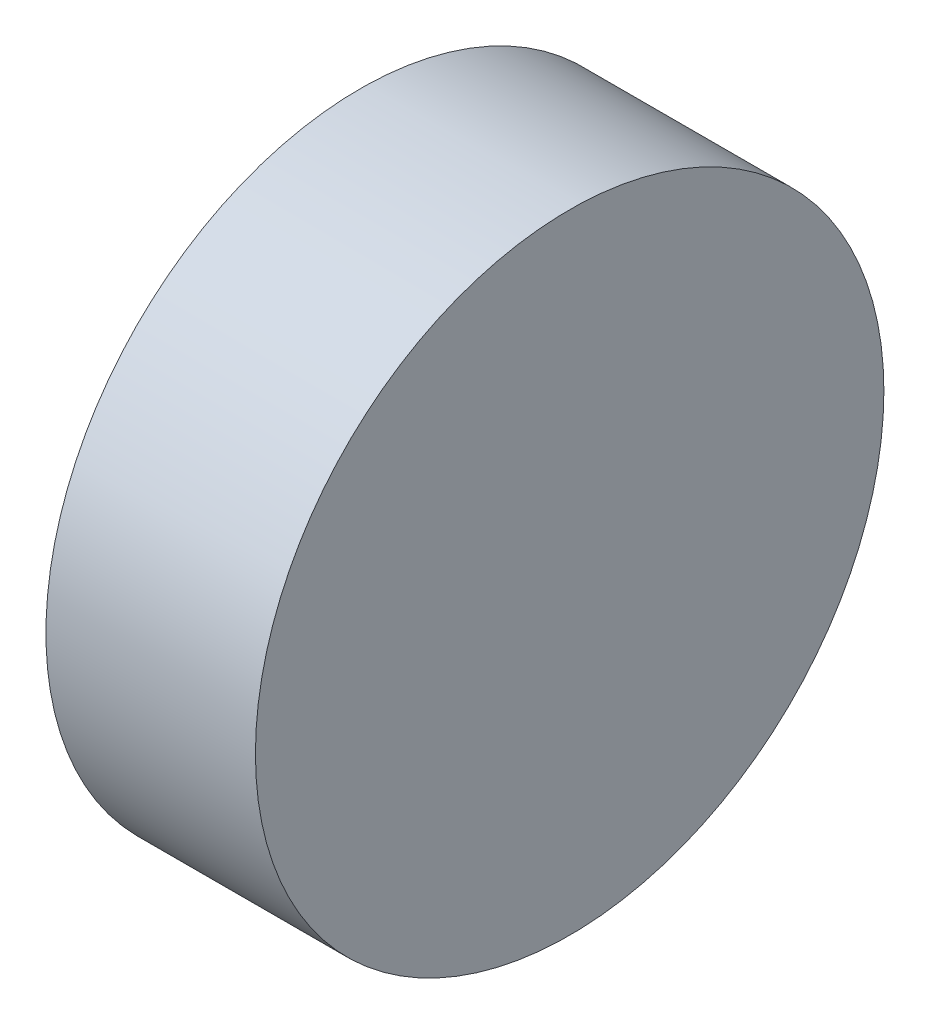
ISO-10303-21;
HEADER;
FILE_DESCRIPTION(('STEP AP214'),'2;1');
FILE_NAME('part.step','',(''),(''),'','','');
FILE_SCHEMA(('AUTOMOTIVE_DESIGN { 1 0 10303 214 1 1 1 1 }'));
ENDSEC;
DATA;
#1=APPLICATION_CONTEXT('core data for automotive mechanical design processes');
#2=APPLICATION_PROTOCOL_DEFINITION('international standard','automotive_design',2000,#1);
#3=PRODUCT_CONTEXT('',#1,'mechanical');
#4=PRODUCT('Part','Part','',(#3));
#5=PRODUCT_RELATED_PRODUCT_CATEGORY('part','',(#4));
#6=PRODUCT_DEFINITION_FORMATION('','',#4);
#7=PRODUCT_DEFINITION_CONTEXT('part definition',#1,'design');
#8=PRODUCT_DEFINITION('design','',#6,#7);
#9=PRODUCT_DEFINITION_SHAPE('','',#8);
#10=(LENGTH_UNIT() NAMED_UNIT(*) SI_UNIT(.MILLI.,.METRE.));
#11=(NAMED_UNIT(*) PLANE_ANGLE_UNIT() SI_UNIT($,.RADIAN.));
#12=(NAMED_UNIT(*) SI_UNIT($,.STERADIAN.) SOLID_ANGLE_UNIT());
#13=UNCERTAINTY_MEASURE_WITH_UNIT(LENGTH_MEASURE(1.E-05),#10,'distance_accuracy_value','');
#14=(GEOMETRIC_REPRESENTATION_CONTEXT(3) GLOBAL_UNCERTAINTY_ASSIGNED_CONTEXT((#13)) GLOBAL_UNIT_ASSIGNED_CONTEXT((#10,
#11,#12)) REPRESENTATION_CONTEXT('',''));
#15=CARTESIAN_POINT('',(0.,0.,0.));
#16=DIRECTION('',(0.,0.,1.));
#17=DIRECTION('',(1.,0.,0.));
#18=AXIS2_PLACEMENT_3D('',#15,#16,#17);
#19=CARTESIAN_POINT('',(2.,0.,0.));
#20=DIRECTION('',(1.,0.,0.));
#21=DIRECTION('',(0.,0.,-1.));
#22=AXIS2_PLACEMENT_3D('',#19,#20,#21);
#23=PLANE('',#22);
#24=CARTESIAN_POINT('',(2.,0.,0.));
#25=DIRECTION('',(-1.,0.,0.));
#26=DIRECTION('',(0.,0.,1.));
#27=AXIS2_PLACEMENT_3D('',#24,#25,#26);
#28=CIRCLE('',#27,6.);
#29=CARTESIAN_POINT('',(2.,0.,6.));
#30=VERTEX_POINT('',#29);
#31=EDGE_CURVE('E10',#30,#30,#28,.T.);
#32=ORIENTED_EDGE('',*,*,#31,.F.);
#33=EDGE_LOOP('',(#32));
#34=FACE_BOUND('',#33,.T.);
#35=ADVANCED_FACE('F15',(#34),#23,.T.);
#36=CARTESIAN_POINT('',(-2.,0.,0.));
#37=DIRECTION('',(-1.,0.,0.));
#38=DIRECTION('',(0.,0.,1.));
#39=AXIS2_PLACEMENT_3D('',#36,#37,#38);
#40=PLANE('',#39);
#41=CARTESIAN_POINT('',(-2.,0.,0.));
#42=DIRECTION('',(1.,0.,0.));
#43=DIRECTION('',(0.,0.,-1.));
#44=AXIS2_PLACEMENT_3D('',#41,#42,#43);
#45=CIRCLE('',#44,6.);
#46=CARTESIAN_POINT('',(-2.,0.,-6.));
#47=VERTEX_POINT('',#46);
#48=EDGE_CURVE('E23',#47,#47,#45,.T.);
#49=ORIENTED_EDGE('',*,*,#48,.F.);
#50=EDGE_LOOP('',(#49));
#51=FACE_BOUND('',#50,.T.);
#52=ADVANCED_FACE('F32',(#51),#40,.T.);
#53=CARTESIAN_POINT('',(-2.,0.,0.));
#54=DIRECTION('',(1.,0.,0.));
#55=DIRECTION('',(0.,0.,-1.));
#56=AXIS2_PLACEMENT_3D('',#53,#54,#55);
#57=CYLINDRICAL_SURFACE('',#56,6.);
#58=ORIENTED_EDGE('',*,*,#31,.T.);
#59=EDGE_LOOP('',(#58));
#60=FACE_BOUND('',#59,.T.);
#61=ORIENTED_EDGE('',*,*,#48,.T.);
#62=EDGE_LOOP('',(#61));
#63=FACE_BOUND('',#62,.T.);
#64=ADVANCED_FACE('F17',(#60,#63),#57,.T.);
#65=CLOSED_SHELL('',(#35,#52,#64));
#66=MANIFOLD_SOLID_BREP('B1',#65);
#67=ADVANCED_BREP_SHAPE_REPRESENTATION('',(#18,#66),#14);
#68=SHAPE_DEFINITION_REPRESENTATION(#9,#67);
ENDSEC;
END-ISO-10303-21;
